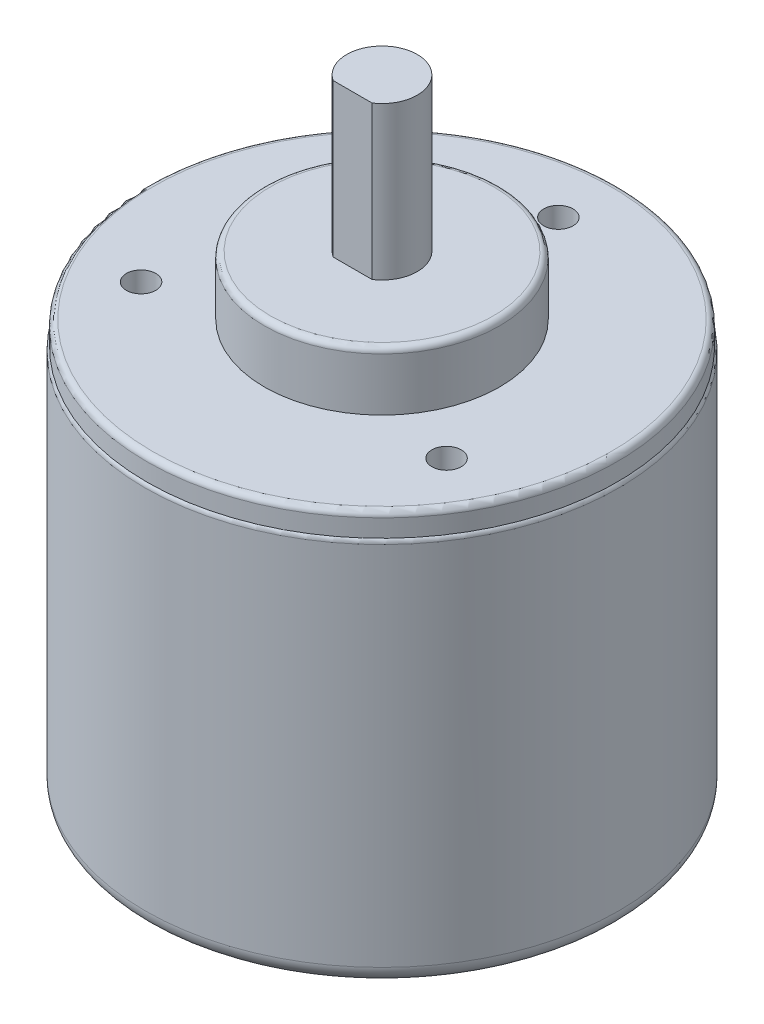
ISO-10303-21;
HEADER;
FILE_DESCRIPTION(('STEP AP214'),'2;1');
FILE_NAME('part.step','',(''),(''),'','','');
FILE_SCHEMA(('AUTOMOTIVE_DESIGN { 1 0 10303 214 1 1 1 1 }'));
ENDSEC;
DATA;
#1=APPLICATION_CONTEXT('core data for automotive mechanical design processes');
#2=APPLICATION_PROTOCOL_DEFINITION('international standard','automotive_design',2000,#1);
#3=PRODUCT_CONTEXT('',#1,'mechanical');
#4=PRODUCT('Part','Part','',(#3));
#5=PRODUCT_RELATED_PRODUCT_CATEGORY('part','',(#4));
#6=PRODUCT_DEFINITION_FORMATION('','',#4);
#7=PRODUCT_DEFINITION_CONTEXT('part definition',#1,'design');
#8=PRODUCT_DEFINITION('design','',#6,#7);
#9=PRODUCT_DEFINITION_SHAPE('','',#8);
#10=(LENGTH_UNIT() NAMED_UNIT(*) SI_UNIT(.MILLI.,.METRE.));
#11=(NAMED_UNIT(*) PLANE_ANGLE_UNIT() SI_UNIT($,.RADIAN.));
#12=(NAMED_UNIT(*) SI_UNIT($,.STERADIAN.) SOLID_ANGLE_UNIT());
#13=UNCERTAINTY_MEASURE_WITH_UNIT(LENGTH_MEASURE(1.E-05),#10,'distance_accuracy_value','');
#14=(GEOMETRIC_REPRESENTATION_CONTEXT(3) GLOBAL_UNCERTAINTY_ASSIGNED_CONTEXT((#13)) GLOBAL_UNIT_ASSIGNED_CONTEXT((#10,
#11,#12)) REPRESENTATION_CONTEXT('',''));
#15=CARTESIAN_POINT('',(0.,0.,0.));
#16=DIRECTION('',(0.,0.,1.));
#17=DIRECTION('',(1.,0.,0.));
#18=AXIS2_PLACEMENT_3D('',#15,#16,#17);
#19=CARTESIAN_POINT('',(0.,5.,0.));
#20=DIRECTION('',(0.,1.,0.));
#21=DIRECTION('',(0.,0.,1.));
#22=AXIS2_PLACEMENT_3D('',#19,#20,#21);
#23=PLANE('',#22);
#24=CARTESIAN_POINT('',(0.,5.,0.));
#25=DIRECTION('',(0.,1.,0.));
#26=DIRECTION('',(0.,0.,1.));
#27=AXIS2_PLACEMENT_3D('',#24,#25,#26);
#28=CIRCLE('',#27,9.5);
#29=CARTESIAN_POINT('',(0.,5.,9.5));
#30=VERTEX_POINT('',#29);
#31=EDGE_CURVE('E124',#30,#30,#28,.T.);
#32=ORIENTED_EDGE('',*,*,#31,.T.);
#33=EDGE_LOOP('',(#32));
#34=FACE_BOUND('',#33,.T.);
#35=DIRECTION('',(1.,0.,0.));
#36=VECTOR('',#35,1.);
#37=CARTESIAN_POINT('',(-1.6583123951777,5.,2.5));
#38=LINE('',#37,#36);
#39=CARTESIAN_POINT('',(-1.6583123951777,5.,2.5));
#40=VERTEX_POINT('',#39);
#41=CARTESIAN_POINT('',(1.6583123951777,5.,2.5));
#42=VERTEX_POINT('',#41);
#43=EDGE_CURVE('E69',#40,#42,#38,.T.);
#44=ORIENTED_EDGE('',*,*,#43,.F.);
#45=CARTESIAN_POINT('',(0.,5.,0.));
#46=DIRECTION('',(0.,1.,0.));
#47=DIRECTION('',(0.,0.,-1.));
#48=AXIS2_PLACEMENT_3D('',#45,#46,#47);
#49=CIRCLE('',#48,3.);
#50=EDGE_CURVE('E52',#42,#40,#49,.T.);
#51=ORIENTED_EDGE('',*,*,#50,.F.);
#52=EDGE_LOOP('',(#44,#51));
#53=FACE_BOUND('',#52,.T.);
#54=ADVANCED_FACE('F37',(#34,#53),#23,.T.);
#55=CARTESIAN_POINT('',(0.,0.,0.));
#56=DIRECTION('',(0.,1.,0.));
#57=DIRECTION('',(0.,0.,1.));
#58=AXIS2_PLACEMENT_3D('',#55,#56,#57);
#59=PLANE('',#58);
#60=CARTESIAN_POINT('',(0.,0.,-15.));
#61=DIRECTION('',(0.,1.,0.));
#62=DIRECTION('',(0.,0.,1.));
#63=AXIS2_PLACEMENT_3D('',#60,#61,#62);
#64=CIRCLE('',#63,1.25);
#65=CARTESIAN_POINT('',(0.,0.,-13.75));
#66=VERTEX_POINT('',#65);
#67=EDGE_CURVE('E90',#66,#66,#64,.T.);
#68=ORIENTED_EDGE('',*,*,#67,.F.);
#69=EDGE_LOOP('',(#68));
#70=FACE_BOUND('',#69,.T.);
#71=CARTESIAN_POINT('',(12.9903810567677,0.,7.49999999999937));
#72=DIRECTION('',(0.,1.,0.));
#73=DIRECTION('',(0.,0.,1.));
#74=AXIS2_PLACEMENT_3D('',#71,#72,#73);
#75=CIRCLE('',#74,1.25);
#76=CARTESIAN_POINT('',(12.9903810567677,0.,8.74999999999937));
#77=VERTEX_POINT('',#76);
#78=EDGE_CURVE('E89',#77,#77,#75,.T.);
#79=ORIENTED_EDGE('',*,*,#78,.F.);
#80=EDGE_LOOP('',(#79));
#81=FACE_BOUND('',#80,.T.);
#82=CARTESIAN_POINT('',(-12.9903810567655,0.,7.50000000000062));
#83=DIRECTION('',(0.,1.,0.));
#84=DIRECTION('',(0.,0.,1.));
#85=AXIS2_PLACEMENT_3D('',#82,#83,#84);
#86=CIRCLE('',#85,1.25);
#87=CARTESIAN_POINT('',(-12.9903810567655,0.,8.75000000000062));
#88=VERTEX_POINT('',#87);
#89=EDGE_CURVE('E100',#88,#88,#86,.T.);
#90=ORIENTED_EDGE('',*,*,#89,.F.);
#91=EDGE_LOOP('',(#90));
#92=FACE_BOUND('',#91,.T.);
#93=CARTESIAN_POINT('',(0.,0.,0.));
#94=DIRECTION('',(0.,1.,0.));
#95=DIRECTION('',(0.,0.,1.));
#96=AXIS2_PLACEMENT_3D('',#93,#94,#95);
#97=CIRCLE('',#96,19.5);
#98=CARTESIAN_POINT('',(0.,0.,19.5));
#99=VERTEX_POINT('',#98);
#100=EDGE_CURVE('E130',#99,#99,#97,.T.);
#101=ORIENTED_EDGE('',*,*,#100,.T.);
#102=EDGE_LOOP('',(#101));
#103=FACE_BOUND('',#102,.T.);
#104=CARTESIAN_POINT('',(0.,0.,0.));
#105=DIRECTION('',(0.,1.,0.));
#106=DIRECTION('',(0.,0.,1.));
#107=AXIS2_PLACEMENT_3D('',#104,#105,#106);
#108=CIRCLE('',#107,10.);
#109=CARTESIAN_POINT('',(0.,0.,10.));
#110=VERTEX_POINT('',#109);
#111=EDGE_CURVE('E115',#110,#110,#108,.T.);
#112=ORIENTED_EDGE('',*,*,#111,.F.);
#113=EDGE_LOOP('',(#112));
#114=FACE_BOUND('',#113,.T.);
#115=ADVANCED_FACE('F154',(#70,#81,#92,#103,#114),#59,.T.);
#116=CARTESIAN_POINT('',(0.,-2.,0.));
#117=DIRECTION('',(0.,1.,0.));
#118=DIRECTION('',(0.,0.,1.));
#119=AXIS2_PLACEMENT_3D('',#116,#117,#118);
#120=CYLINDRICAL_SURFACE('',#119,20.);
#121=CARTESIAN_POINT('',(0.,-0.5,0.));
#122=DIRECTION('',(0.,1.,0.));
#123=DIRECTION('',(0.,0.,1.));
#124=AXIS2_PLACEMENT_3D('',#121,#122,#123);
#125=CIRCLE('',#124,20.);
#126=CARTESIAN_POINT('',(0.,-0.5,20.));
#127=VERTEX_POINT('',#126);
#128=EDGE_CURVE('E133',#127,#127,#125,.F.);
#129=ORIENTED_EDGE('',*,*,#128,.T.);
#130=EDGE_LOOP('',(#129));
#131=FACE_BOUND('',#130,.T.);
#132=CARTESIAN_POINT('',(0.,-2.,0.));
#133=DIRECTION('',(0.,-1.,0.));
#134=DIRECTION('',(0.,0.,-1.));
#135=AXIS2_PLACEMENT_3D('',#132,#133,#134);
#136=CIRCLE('',#135,20.);
#137=CARTESIAN_POINT('',(0.,-2.,-20.));
#138=VERTEX_POINT('',#137);
#139=EDGE_CURVE('E118',#138,#138,#136,.F.);
#140=ORIENTED_EDGE('',*,*,#139,.T.);
#141=EDGE_LOOP('',(#140));
#142=FACE_BOUND('',#141,.T.);
#143=ADVANCED_FACE('F160',(#131,#142),#120,.T.);
#144=CARTESIAN_POINT('',(0.,-35.,0.));
#145=DIRECTION('',(0.,1.,0.));
#146=DIRECTION('',(0.,0.,1.));
#147=AXIS2_PLACEMENT_3D('',#144,#145,#146);
#148=CYLINDRICAL_SURFACE('',#147,20.15);
#149=CARTESIAN_POINT('',(0.,-33.5,0.));
#150=DIRECTION('',(0.,-1.,0.));
#151=DIRECTION('',(0.,0.,-1.));
#152=AXIS2_PLACEMENT_3D('',#149,#150,#151);
#153=CIRCLE('',#152,20.15);
#154=CARTESIAN_POINT('',(0.,-33.5,-20.15));
#155=VERTEX_POINT('',#154);
#156=EDGE_CURVE('E11',#155,#155,#153,.F.);
#157=ORIENTED_EDGE('',*,*,#156,.T.);
#158=EDGE_LOOP('',(#157));
#159=FACE_BOUND('',#158,.T.);
#160=CARTESIAN_POINT('',(0.,-2.35707142142715,0.));
#161=DIRECTION('',(0.,1.,0.));
#162=DIRECTION('',(0.,0.,1.));
#163=AXIS2_PLACEMENT_3D('',#160,#161,#162);
#164=CIRCLE('',#163,20.15);
#165=CARTESIAN_POINT('',(0.,-2.35707142142715,20.15));
#166=VERTEX_POINT('',#165);
#167=EDGE_CURVE('E121',#166,#166,#164,.F.);
#168=ORIENTED_EDGE('',*,*,#167,.T.);
#169=EDGE_LOOP('',(#168));
#170=FACE_BOUND('',#169,.T.);
#171=ADVANCED_FACE('F174',(#159,#170),#148,.T.);
#172=CARTESIAN_POINT('',(0.,-35.,0.));
#173=DIRECTION('',(0.,-1.,0.));
#174=DIRECTION('',(0.,0.,-1.));
#175=AXIS2_PLACEMENT_3D('',#172,#173,#174);
#176=PLANE('',#175);
#177=CARTESIAN_POINT('',(0.,-35.,0.));
#178=DIRECTION('',(0.,-1.,0.));
#179=DIRECTION('',(0.,0.,-1.));
#180=AXIS2_PLACEMENT_3D('',#177,#178,#179);
#181=CIRCLE('',#180,18.65);
#182=CARTESIAN_POINT('',(0.,-35.,-18.65));
#183=VERTEX_POINT('',#182);
#184=EDGE_CURVE('E45',#183,#183,#181,.T.);
#185=ORIENTED_EDGE('',*,*,#184,.T.);
#186=EDGE_LOOP('',(#185));
#187=FACE_BOUND('',#186,.T.);
#188=ADVANCED_FACE('F138',(#187),#176,.T.);
#189=CARTESIAN_POINT('',(0.,5.,0.));
#190=DIRECTION('',(0.,-1.,0.));
#191=DIRECTION('',(0.,0.,-1.));
#192=AXIS2_PLACEMENT_3D('',#189,#190,#191);
#193=CYLINDRICAL_SURFACE('',#192,10.);
#194=CARTESIAN_POINT('',(0.,4.5,0.));
#195=DIRECTION('',(0.,1.,0.));
#196=DIRECTION('',(0.,0.,1.));
#197=AXIS2_PLACEMENT_3D('',#194,#195,#196);
#198=CIRCLE('',#197,10.);
#199=CARTESIAN_POINT('',(0.,4.5,10.));
#200=VERTEX_POINT('',#199);
#201=EDGE_CURVE('E127',#200,#200,#198,.F.);
#202=ORIENTED_EDGE('',*,*,#201,.T.);
#203=EDGE_LOOP('',(#202));
#204=FACE_BOUND('',#203,.T.);
#205=ORIENTED_EDGE('',*,*,#111,.T.);
#206=EDGE_LOOP('',(#205));
#207=FACE_BOUND('',#206,.T.);
#208=ADVANCED_FACE('F168',(#204,#207),#193,.T.);
#209=CARTESIAN_POINT('',(0.,18.,0.));
#210=DIRECTION('',(0.,-1.,0.));
#211=DIRECTION('',(0.,0.,-1.));
#212=AXIS2_PLACEMENT_3D('',#209,#210,#211);
#213=CYLINDRICAL_SURFACE('',#212,3.);
#214=ORIENTED_EDGE('',*,*,#50,.T.);
#215=DIRECTION('',(0.,-1.,0.));
#216=VECTOR('',#215,1.);
#217=CARTESIAN_POINT('',(-1.6583123951777,18.,2.5));
#218=LINE('',#217,#216);
#219=CARTESIAN_POINT('',(-1.6583123951777,18.,2.5));
#220=VERTEX_POINT('',#219);
#221=EDGE_CURVE('E113',#220,#40,#218,.T.);
#222=ORIENTED_EDGE('',*,*,#221,.F.);
#223=CARTESIAN_POINT('',(0.,18.,0.));
#224=DIRECTION('',(0.,1.,0.));
#225=DIRECTION('',(0.,0.,-1.));
#226=AXIS2_PLACEMENT_3D('',#223,#224,#225);
#227=CIRCLE('',#226,3.);
#228=CARTESIAN_POINT('',(1.6583123951777,18.,2.5));
#229=VERTEX_POINT('',#228);
#230=EDGE_CURVE('E106',#229,#220,#227,.T.);
#231=ORIENTED_EDGE('',*,*,#230,.F.);
#232=DIRECTION('',(0.,-1.,0.));
#233=VECTOR('',#232,1.);
#234=CARTESIAN_POINT('',(1.6583123951777,18.,2.5));
#235=LINE('',#234,#233);
#236=EDGE_CURVE('E109',#229,#42,#235,.T.);
#237=ORIENTED_EDGE('',*,*,#236,.T.);
#238=EDGE_LOOP('',(#214,#222,#231,#237));
#239=FACE_BOUND('',#238,.T.);
#240=ADVANCED_FACE('F166',(#239),#213,.T.);
#241=CARTESIAN_POINT('',(-1.6583123951777,18.,2.5));
#242=DIRECTION('',(0.,0.,-1.));
#243=DIRECTION('',(-1.,0.,0.));
#244=AXIS2_PLACEMENT_3D('',#241,#242,#243);
#245=PLANE('',#244);
#246=ORIENTED_EDGE('',*,*,#43,.T.);
#247=ORIENTED_EDGE('',*,*,#236,.F.);
#248=DIRECTION('',(1.,0.,0.));
#249=VECTOR('',#248,1.);
#250=CARTESIAN_POINT('',(-1.6583123951777,18.,2.5));
#251=LINE('',#250,#249);
#252=EDGE_CURVE('E60',#220,#229,#251,.T.);
#253=ORIENTED_EDGE('',*,*,#252,.F.);
#254=ORIENTED_EDGE('',*,*,#221,.T.);
#255=EDGE_LOOP('',(#246,#247,#253,#254));
#256=FACE_BOUND('',#255,.T.);
#257=ADVANCED_FACE('F286',(#256),#245,.F.);
#258=CARTESIAN_POINT('',(0.,18.,0.));
#259=DIRECTION('',(0.,-1.,0.));
#260=DIRECTION('',(0.,0.,-1.));
#261=AXIS2_PLACEMENT_3D('',#258,#259,#260);
#262=PLANE('',#261);
#263=ORIENTED_EDGE('',*,*,#230,.T.);
#264=ORIENTED_EDGE('',*,*,#252,.T.);
#265=EDGE_LOOP('',(#263,#264));
#266=FACE_BOUND('',#265,.T.);
#267=ADVANCED_FACE('F184',(#266),#262,.F.);
#268=CARTESIAN_POINT('',(0.,-2.35707142142714,0.));
#269=DIRECTION('',(0.,1.,0.));
#270=DIRECTION('',(0.,0.,1.));
#271=AXIS2_PLACEMENT_3D('',#268,#269,#270);
#272=TOROIDAL_SURFACE('',#271,19.65,0.5);
#273=ORIENTED_EDGE('',*,*,#139,.F.);
#274=EDGE_LOOP('',(#273));
#275=FACE_BOUND('',#274,.T.);
#276=ORIENTED_EDGE('',*,*,#167,.F.);
#277=EDGE_LOOP('',(#276));
#278=FACE_BOUND('',#277,.T.);
#279=ADVANCED_FACE('F181',(#275,#278),#272,.T.);
#280=CARTESIAN_POINT('',(0.,4.5,0.));
#281=DIRECTION('',(0.,1.,0.));
#282=DIRECTION('',(0.,0.,1.));
#283=AXIS2_PLACEMENT_3D('',#280,#281,#282);
#284=TOROIDAL_SURFACE('',#283,9.5,0.5);
#285=ORIENTED_EDGE('',*,*,#201,.F.);
#286=EDGE_LOOP('',(#285));
#287=FACE_BOUND('',#286,.T.);
#288=ORIENTED_EDGE('',*,*,#31,.F.);
#289=EDGE_LOOP('',(#288));
#290=FACE_BOUND('',#289,.T.);
#291=ADVANCED_FACE('F150',(#287,#290),#284,.T.);
#292=CARTESIAN_POINT('',(0.,-0.5,0.));
#293=DIRECTION('',(0.,1.,0.));
#294=DIRECTION('',(0.,0.,1.));
#295=AXIS2_PLACEMENT_3D('',#292,#293,#294);
#296=TOROIDAL_SURFACE('',#295,19.5,0.5);
#297=ORIENTED_EDGE('',*,*,#128,.F.);
#298=EDGE_LOOP('',(#297));
#299=FACE_BOUND('',#298,.T.);
#300=ORIENTED_EDGE('',*,*,#100,.F.);
#301=EDGE_LOOP('',(#300));
#302=FACE_BOUND('',#301,.T.);
#303=ADVANCED_FACE('F142',(#299,#302),#296,.T.);
#304=CARTESIAN_POINT('',(0.,-33.5,0.));
#305=DIRECTION('',(0.,-1.,0.));
#306=DIRECTION('',(0.,0.,-1.));
#307=AXIS2_PLACEMENT_3D('',#304,#305,#306);
#308=TOROIDAL_SURFACE('',#307,18.65,1.5);
#309=ORIENTED_EDGE('',*,*,#156,.F.);
#310=EDGE_LOOP('',(#309));
#311=FACE_BOUND('',#310,.T.);
#312=ORIENTED_EDGE('',*,*,#184,.F.);
#313=EDGE_LOOP('',(#312));
#314=FACE_BOUND('',#313,.T.);
#315=ADVANCED_FACE('F39',(#311,#314),#308,.T.);
#316=CARTESIAN_POINT('',(-12.9903810567655,-5.5,7.50000000000062));
#317=DIRECTION('',(0.,1.,0.));
#318=DIRECTION('',(0.,0.,1.));
#319=AXIS2_PLACEMENT_3D('',#316,#317,#318);
#320=CONICAL_SURFACE('',#319,1.25,1.02974425867665);
#321=CARTESIAN_POINT('',(-12.9903810567655,-6.25107577378445,7.50000000000062));
#322=VERTEX_POINT('',#321);
#323=VERTEX_LOOP('',#322);
#324=FACE_BOUND('',#323,.T.);
#325=CARTESIAN_POINT('',(-12.9903810567655,-5.5,7.50000000000062));
#326=DIRECTION('',(0.,1.,0.));
#327=DIRECTION('',(0.,0.,1.));
#328=AXIS2_PLACEMENT_3D('',#325,#326,#327);
#329=CIRCLE('',#328,1.25);
#330=CARTESIAN_POINT('',(-12.9903810567655,-5.5,8.75000000000062));
#331=VERTEX_POINT('',#330);
#332=EDGE_CURVE('E103',#331,#331,#329,.T.);
#333=ORIENTED_EDGE('',*,*,#332,.T.);
#334=EDGE_LOOP('',(#333));
#335=FACE_BOUND('',#334,.T.);
#336=ADVANCED_FACE('F141',(#324,#335),#320,.F.);
#337=CARTESIAN_POINT('',(-12.9903810567655,0.,7.50000000000062));
#338=DIRECTION('',(0.,1.,0.));
#339=DIRECTION('',(0.,0.,1.));
#340=AXIS2_PLACEMENT_3D('',#337,#338,#339);
#341=CYLINDRICAL_SURFACE('',#340,1.25);
#342=ORIENTED_EDGE('',*,*,#332,.F.);
#343=EDGE_LOOP('',(#342));
#344=FACE_BOUND('',#343,.T.);
#345=ORIENTED_EDGE('',*,*,#89,.T.);
#346=EDGE_LOOP('',(#345));
#347=FACE_BOUND('',#346,.T.);
#348=ADVANCED_FACE('F148',(#344,#347),#341,.F.);
#349=CARTESIAN_POINT('',(12.9903810567677,-5.5,7.49999999999937));
#350=DIRECTION('',(0.,1.,0.));
#351=DIRECTION('',(0.,0.,1.));
#352=AXIS2_PLACEMENT_3D('',#349,#350,#351);
#353=CONICAL_SURFACE('',#352,1.25,1.02974425867665);
#354=CARTESIAN_POINT('',(12.9903810567677,-6.25107577378445,7.49999999999937));
#355=VERTEX_POINT('',#354);
#356=VERTEX_LOOP('',#355);
#357=FACE_BOUND('',#356,.T.);
#358=CARTESIAN_POINT('',(12.9903810567677,-5.5,7.49999999999937));
#359=DIRECTION('',(0.,1.,0.));
#360=DIRECTION('',(0.,0.,1.));
#361=AXIS2_PLACEMENT_3D('',#358,#359,#360);
#362=CIRCLE('',#361,1.25);
#363=CARTESIAN_POINT('',(12.9903810567677,-5.5,8.74999999999937));
#364=VERTEX_POINT('',#363);
#365=EDGE_CURVE('E93',#364,#364,#362,.T.);
#366=ORIENTED_EDGE('',*,*,#365,.T.);
#367=EDGE_LOOP('',(#366));
#368=FACE_BOUND('',#367,.T.);
#369=ADVANCED_FACE('F243',(#357,#368),#353,.F.);
#370=CARTESIAN_POINT('',(12.9903810567677,0.,7.49999999999937));
#371=DIRECTION('',(0.,1.,0.));
#372=DIRECTION('',(0.,0.,1.));
#373=AXIS2_PLACEMENT_3D('',#370,#371,#372);
#374=CYLINDRICAL_SURFACE('',#373,1.25);
#375=ORIENTED_EDGE('',*,*,#365,.F.);
#376=EDGE_LOOP('',(#375));
#377=FACE_BOUND('',#376,.T.);
#378=ORIENTED_EDGE('',*,*,#78,.T.);
#379=EDGE_LOOP('',(#378));
#380=FACE_BOUND('',#379,.T.);
#381=ADVANCED_FACE('F83',(#377,#380),#374,.F.);
#382=CARTESIAN_POINT('',(0.,-5.5,-15.));
#383=DIRECTION('',(0.,1.,0.));
#384=DIRECTION('',(0.,0.,1.));
#385=AXIS2_PLACEMENT_3D('',#382,#383,#384);
#386=CONICAL_SURFACE('',#385,1.25,1.02974425867665);
#387=CARTESIAN_POINT('',(0.,-6.25107577378445,-15.));
#388=VERTEX_POINT('',#387);
#389=VERTEX_LOOP('',#388);
#390=FACE_BOUND('',#389,.T.);
#391=CARTESIAN_POINT('',(0.,-5.5,-15.));
#392=DIRECTION('',(0.,1.,0.));
#393=DIRECTION('',(0.,0.,1.));
#394=AXIS2_PLACEMENT_3D('',#391,#392,#393);
#395=CIRCLE('',#394,1.25);
#396=CARTESIAN_POINT('',(0.,-5.5,-13.75));
#397=VERTEX_POINT('',#396);
#398=EDGE_CURVE('E87',#397,#397,#395,.T.);
#399=ORIENTED_EDGE('',*,*,#398,.T.);
#400=EDGE_LOOP('',(#399));
#401=FACE_BOUND('',#400,.T.);
#402=ADVANCED_FACE('F79',(#390,#401),#386,.F.);
#403=CARTESIAN_POINT('',(0.,0.,-15.));
#404=DIRECTION('',(0.,1.,0.));
#405=DIRECTION('',(0.,0.,1.));
#406=AXIS2_PLACEMENT_3D('',#403,#404,#405);
#407=CYLINDRICAL_SURFACE('',#406,1.25);
#408=ORIENTED_EDGE('',*,*,#398,.F.);
#409=EDGE_LOOP('',(#408));
#410=FACE_BOUND('',#409,.T.);
#411=ORIENTED_EDGE('',*,*,#67,.T.);
#412=EDGE_LOOP('',(#411));
#413=FACE_BOUND('',#412,.T.);
#414=ADVANCED_FACE('F82',(#410,#413),#407,.F.);
#415=CLOSED_SHELL('',(#54,#115,#143,#171,#188,#208,#240,#257,#267,#279,#291,#303,#315,#336,#348,
#369,#381,#402,#414));
#416=MANIFOLD_SOLID_BREP('B2',#415);
#417=ADVANCED_BREP_SHAPE_REPRESENTATION('',(#18,#416),#14);
#418=SHAPE_DEFINITION_REPRESENTATION(#9,#417);
ENDSEC;
END-ISO-10303-21;
